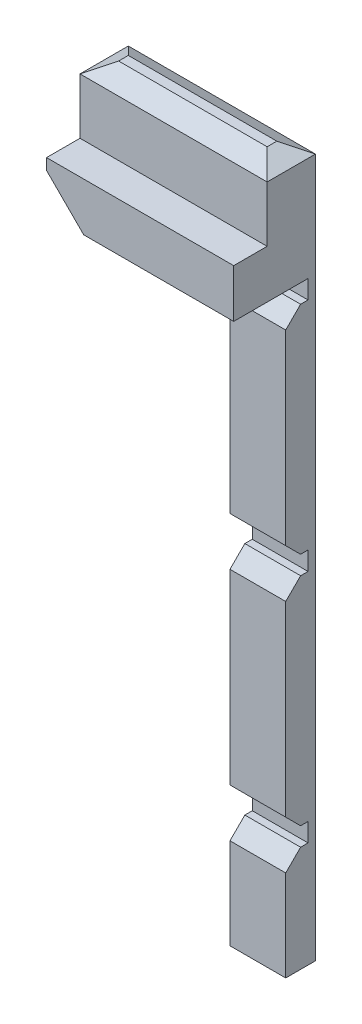
ISO-10303-21;
HEADER;
FILE_DESCRIPTION(('STEP AP214'),'2;1');
FILE_NAME('part.step','',(''),(''),'','','');
FILE_SCHEMA(('AUTOMOTIVE_DESIGN { 1 0 10303 214 1 1 1 1 }'));
ENDSEC;
DATA;
#1=APPLICATION_CONTEXT('core data for automotive mechanical design processes');
#2=APPLICATION_PROTOCOL_DEFINITION('international standard','automotive_design',2000,#1);
#3=PRODUCT_CONTEXT('',#1,'mechanical');
#4=PRODUCT('Part','Part','',(#3));
#5=PRODUCT_RELATED_PRODUCT_CATEGORY('part','',(#4));
#6=PRODUCT_DEFINITION_FORMATION('','',#4);
#7=PRODUCT_DEFINITION_CONTEXT('part definition',#1,'design');
#8=PRODUCT_DEFINITION('design','',#6,#7);
#9=PRODUCT_DEFINITION_SHAPE('','',#8);
#10=(LENGTH_UNIT() NAMED_UNIT(*) SI_UNIT(.MILLI.,.METRE.));
#11=(NAMED_UNIT(*) PLANE_ANGLE_UNIT() SI_UNIT($,.RADIAN.));
#12=(NAMED_UNIT(*) SI_UNIT($,.STERADIAN.) SOLID_ANGLE_UNIT());
#13=UNCERTAINTY_MEASURE_WITH_UNIT(LENGTH_MEASURE(1.E-05),#10,'distance_accuracy_value','');
#14=(GEOMETRIC_REPRESENTATION_CONTEXT(3) GLOBAL_UNCERTAINTY_ASSIGNED_CONTEXT((#13)) GLOBAL_UNIT_ASSIGNED_CONTEXT((#10,
#11,#12)) REPRESENTATION_CONTEXT('',''));
#15=CARTESIAN_POINT('',(0.,0.,0.));
#16=DIRECTION('',(0.,0.,1.));
#17=DIRECTION('',(1.,0.,0.));
#18=AXIS2_PLACEMENT_3D('',#15,#16,#17);
#19=CARTESIAN_POINT('',(-0.00360949708306024,-10.5868919372659,-4.06299852768101));
#20=DIRECTION('',(0.,0.,1.));
#21=DIRECTION('',(1.,0.,0.));
#22=AXIS2_PLACEMENT_3D('',#19,#20,#21);
#23=PLANE('',#22);
#24=DIRECTION('',(0.707106781186547,-0.707106781186548,0.));
#25=VECTOR('',#24,1.);
#26=CARTESIAN_POINT('',(-10.5091357632389,-17.8887340259845,-4.06299852768101));
#27=LINE('',#26,#25);
#28=CARTESIAN_POINT('',(-15.1109778519575,-13.2868919372659,-4.06299852768101));
#29=VERTEX_POINT('',#28);
#30=CARTESIAN_POINT('',(-9.11097785195748,-19.2868919372659,-4.06299852768101));
#31=VERTEX_POINT('',#30);
#32=EDGE_CURVE('E396',#29,#31,#27,.T.);
#33=ORIENTED_EDGE('',*,*,#32,.F.);
#34=DIRECTION('',(0.,-1.,0.));
#35=VECTOR('',#34,1.);
#36=CARTESIAN_POINT('',(-15.1109778519575,-6.53689193726586,-4.06299852768101));
#37=LINE('',#36,#35);
#38=CARTESIAN_POINT('',(-15.1109778519575,-2.48689193726586,-4.06299852768101));
#39=VERTEX_POINT('',#38);
#40=EDGE_CURVE('E316',#39,#29,#37,.T.);
#41=ORIENTED_EDGE('',*,*,#40,.F.);
#42=DIRECTION('',(-1.,0.,0.));
#43=VECTOR('',#42,1.);
#44=CARTESIAN_POINT('',(7.55007468035412,-2.48689193726586,-4.06299852768101));
#45=LINE('',#44,#43);
#46=CARTESIAN_POINT('',(15.1037588577913,-2.48689193726586,-4.06299852768101));
#47=VERTEX_POINT('',#46);
#48=EDGE_CURVE('E319',#47,#39,#45,.T.);
#49=ORIENTED_EDGE('',*,*,#48,.F.);
#50=DIRECTION('',(0.,1.,0.));
#51=VECTOR('',#50,1.);
#52=CARTESIAN_POINT('',(15.1037588577913,-14.9368919372659,-4.06299852768101));
#53=LINE('',#52,#51);
#54=CARTESIAN_POINT('',(15.1037588577913,-115.286891937266,-4.06299852768101));
#55=VERTEX_POINT('',#54);
#56=EDGE_CURVE('E357',#55,#47,#53,.T.);
#57=ORIENTED_EDGE('',*,*,#56,.F.);
#58=DIRECTION('',(1.,0.,0.));
#59=VECTOR('',#58,1.);
#60=CARTESIAN_POINT('',(3.10375885779133,-115.286891937266,-4.06299852768101));
#61=LINE('',#60,#59);
#62=CARTESIAN_POINT('',(6.10375885779132,-115.286891937266,-4.06299852768101));
#63=VERTEX_POINT('',#62);
#64=EDGE_CURVE('E436',#63,#55,#61,.T.);
#65=ORIENTED_EDGE('',*,*,#64,.F.);
#66=DIRECTION('',(0.,-1.,0.));
#67=VECTOR('',#66,1.);
#68=CARTESIAN_POINT('',(6.10375885779132,-14.9368919372659,-4.06299852768101));
#69=LINE('',#68,#67);
#70=CARTESIAN_POINT('',(6.10375885779132,-19.2868919372659,-4.06299852768101));
#71=VERTEX_POINT('',#70);
#72=EDGE_CURVE('E24',#71,#63,#69,.T.);
#73=ORIENTED_EDGE('',*,*,#72,.F.);
#74=DIRECTION('',(1.,0.,0.));
#75=VECTOR('',#74,1.);
#76=CARTESIAN_POINT('',(-7.55729367452028,-19.2868919372659,-4.06299852768101));
#77=LINE('',#76,#75);
#78=EDGE_CURVE('E10',#31,#71,#77,.T.);
#79=ORIENTED_EDGE('',*,*,#78,.F.);
#80=EDGE_LOOP('',(#33,#41,#49,#57,#65,#73,#79));
#81=FACE_BOUND('',#80,.T.);
#82=ADVANCED_FACE('F16',(#81),#23,.F.);
#83=CARTESIAN_POINT('',(-15.1109778519575,-19.2868919372659,-4.66299852768101));
#84=DIRECTION('',(0.,-1.,0.));
#85=DIRECTION('',(0.,0.,-1.));
#86=AXIS2_PLACEMENT_3D('',#83,#84,#85);
#87=PLANE('',#86);
#88=DIRECTION('',(0.,0.,1.));
#89=VECTOR('',#88,1.);
#90=CARTESIAN_POINT('',(-9.11097785195748,-19.2868919372659,3.73700147231899));
#91=LINE('',#90,#89);
#92=CARTESIAN_POINT('',(-9.11097785195748,-19.2868919372659,9.13700147231898));
#93=VERTEX_POINT('',#92);
#94=EDGE_CURVE('E399',#31,#93,#91,.T.);
#95=ORIENTED_EDGE('',*,*,#94,.F.);
#96=ORIENTED_EDGE('',*,*,#78,.T.);
#97=DIRECTION('',(0.,0.,1.));
#98=VECTOR('',#97,1.);
#99=CARTESIAN_POINT('',(6.10375885779132,-19.2868919372659,-4.36299852768102));
#100=LINE('',#99,#98);
#101=CARTESIAN_POINT('',(6.10375885779132,-19.2868919372659,-2.86299852768101));
#102=VERTEX_POINT('',#101);
#103=EDGE_CURVE('E307',#71,#102,#100,.T.);
#104=ORIENTED_EDGE('',*,*,#103,.T.);
#105=DIRECTION('',(1.,0.,0.));
#106=VECTOR('',#105,1.);
#107=CARTESIAN_POINT('',(-7.55729367452028,-19.2868919372659,-2.86299852768101));
#108=LINE('',#107,#106);
#109=CARTESIAN_POINT('',(15.1037588577913,-19.2868919372659,-2.86299852768101));
#110=VERTEX_POINT('',#109);
#111=EDGE_CURVE('E440',#102,#110,#108,.T.);
#112=ORIENTED_EDGE('',*,*,#111,.T.);
#113=DIRECTION('',(0.,0.,1.));
#114=VECTOR('',#113,1.);
#115=CARTESIAN_POINT('',(15.1037588577913,-19.2868919372659,3.73700147231899));
#116=LINE('',#115,#114);
#117=CARTESIAN_POINT('',(15.1037588577913,-19.2868919372659,9.13700147231898));
#118=VERTEX_POINT('',#117);
#119=EDGE_CURVE('E354',#110,#118,#116,.T.);
#120=ORIENTED_EDGE('',*,*,#119,.T.);
#121=DIRECTION('',(1.,0.,0.));
#122=VECTOR('',#121,1.);
#123=CARTESIAN_POINT('',(-9.11097785195748,-19.2868919372659,9.13700147231898));
#124=LINE('',#123,#122);
#125=EDGE_CURVE('E351',#93,#118,#124,.T.);
#126=ORIENTED_EDGE('',*,*,#125,.F.);
#127=EDGE_LOOP('',(#95,#96,#104,#112,#120,#126));
#128=FACE_BOUND('',#127,.T.);
#129=ADVANCED_FACE('F848',(#128),#87,.T.);
#130=CARTESIAN_POINT('',(6.10375885779132,-19.2868919372659,-4.06299852768101));
#131=DIRECTION('',(-1.,0.,0.));
#132=DIRECTION('',(0.,0.,1.));
#133=AXIS2_PLACEMENT_3D('',#130,#131,#132);
#134=PLANE('',#133);
#135=DIRECTION('',(0.,-0.707106781186548,0.707106781186547));
#136=VECTOR('',#135,1.);
#137=CARTESIAN_POINT('',(6.10375885779132,-78.473023736247,-21.3917091273414));
#138=LINE('',#137,#136);
#139=CARTESIAN_POINT('',(6.10375885779132,-98.2017343359072,-1.66299852768101));
#140=VERTEX_POINT('',#139);
#141=CARTESIAN_POINT('',(6.10375885779132,-100.601734335907,0.737001472318992));
#142=VERTEX_POINT('',#141);
#143=EDGE_CURVE('E313',#140,#142,#138,.T.);
#144=ORIENTED_EDGE('',*,*,#143,.F.);
#145=DIRECTION('',(0.,0.,1.));
#146=VECTOR('',#145,1.);
#147=CARTESIAN_POINT('',(6.10375885779132,-98.2017343359072,-2.86299852768101));
#148=LINE('',#147,#146);
#149=CARTESIAN_POINT('',(6.10375885779132,-98.2017343359072,-2.86299852768101));
#150=VERTEX_POINT('',#149);
#151=EDGE_CURVE('E385',#150,#140,#148,.T.);
#152=ORIENTED_EDGE('',*,*,#151,.F.);
#153=DIRECTION('',(0.,-1.,0.));
#154=VECTOR('',#153,1.);
#155=CARTESIAN_POINT('',(6.10375885779132,-39.0868919372658,-2.86299852768101));
#156=LINE('',#155,#154);
#157=CARTESIAN_POINT('',(6.10375885779132,-95.2017343359072,-2.86299852768101));
#158=VERTEX_POINT('',#157);
#159=EDGE_CURVE('E421',#158,#150,#156,.T.);
#160=ORIENTED_EDGE('',*,*,#159,.F.);
#161=DIRECTION('',(0.,0.,1.));
#162=VECTOR('',#161,1.);
#163=CARTESIAN_POINT('',(6.10375885779132,-95.2017343359072,-2.86299852768101));
#164=LINE('',#163,#162);
#165=CARTESIAN_POINT('',(6.10375885779132,-95.2017343359072,-1.66299852768101));
#166=VERTEX_POINT('',#165);
#167=EDGE_CURVE('E535',#158,#166,#164,.T.);
#168=ORIENTED_EDGE('',*,*,#167,.T.);
#169=DIRECTION('',(0.,-0.707106781186548,-0.707106781186547));
#170=VECTOR('',#169,1.);
#171=CARTESIAN_POINT('',(6.10375885779132,-76.223023736247,17.3157120719793));
#172=LINE('',#171,#170);
#173=CARTESIAN_POINT('',(6.10375885779132,-92.8017343359072,0.737001472318992));
#174=VERTEX_POINT('',#173);
#175=EDGE_CURVE('E499',#174,#166,#172,.T.);
#176=ORIENTED_EDGE('',*,*,#175,.F.);
#177=DIRECTION('',(0.,-1.,0.));
#178=VECTOR('',#177,1.);
#179=CARTESIAN_POINT('',(6.10375885779132,-95.2017343359072,0.737001472318992));
#180=LINE('',#179,#178);
#181=CARTESIAN_POINT('',(6.10375885779132,-62.6443131365868,0.737001472318992));
#182=VERTEX_POINT('',#181);
#183=EDGE_CURVE('E461',#182,#174,#180,.T.);
#184=ORIENTED_EDGE('',*,*,#183,.F.);
#185=DIRECTION('',(0.,-0.707106781186548,0.707106781186547));
#186=VECTOR('',#185,1.);
#187=CARTESIAN_POINT('',(6.10375885779132,-50.0049578367564,-11.9023538275112));
#188=LINE('',#187,#186);
#189=CARTESIAN_POINT('',(6.10375885779132,-60.2443131365868,-1.66299852768101));
#190=VERTEX_POINT('',#189);
#191=EDGE_CURVE('E415',#190,#182,#188,.T.);
#192=ORIENTED_EDGE('',*,*,#191,.F.);
#193=DIRECTION('',(0.,0.,1.));
#194=VECTOR('',#193,1.);
#195=CARTESIAN_POINT('',(6.10375885779132,-60.2443131365868,-2.86299852768101));
#196=LINE('',#195,#194);
#197=CARTESIAN_POINT('',(6.10375885779132,-60.2443131365868,-2.86299852768101));
#198=VERTEX_POINT('',#197);
#199=EDGE_CURVE('E333',#198,#190,#196,.T.);
#200=ORIENTED_EDGE('',*,*,#199,.F.);
#201=DIRECTION('',(0.,-1.,0.));
#202=VECTOR('',#201,1.);
#203=CARTESIAN_POINT('',(6.10375885779132,-39.0868919372658,-2.86299852768101));
#204=LINE('',#203,#202);
#205=CARTESIAN_POINT('',(6.10375885779132,-57.2443131365866,-2.86299852768101));
#206=VERTEX_POINT('',#205);
#207=EDGE_CURVE('E426',#206,#198,#204,.T.);
#208=ORIENTED_EDGE('',*,*,#207,.F.);
#209=DIRECTION('',(0.,0.,1.));
#210=VECTOR('',#209,1.);
#211=CARTESIAN_POINT('',(6.10375885779132,-57.2443131365866,-2.86299852768101));
#212=LINE('',#211,#210);
#213=CARTESIAN_POINT('',(6.10375885779132,-57.2443131365866,-1.66299852768101));
#214=VERTEX_POINT('',#213);
#215=EDGE_CURVE('E388',#206,#214,#212,.T.);
#216=ORIENTED_EDGE('',*,*,#215,.T.);
#217=DIRECTION('',(0.,-0.707106781186548,-0.707106781186547));
#218=VECTOR('',#217,1.);
#219=CARTESIAN_POINT('',(6.10375885779132,-47.7549578367564,7.8263567721492));
#220=LINE('',#219,#218);
#221=CARTESIAN_POINT('',(6.10375885779132,-54.8443131365866,0.737001472318992));
#222=VERTEX_POINT('',#221);
#223=EDGE_CURVE('E331',#222,#214,#220,.T.);
#224=ORIENTED_EDGE('',*,*,#223,.F.);
#225=DIRECTION('',(0.,-1.,0.));
#226=VECTOR('',#225,1.);
#227=CARTESIAN_POINT('',(6.10375885779132,-57.2443131365866,0.737001472318992));
#228=LINE('',#227,#226);
#229=CARTESIAN_POINT('',(6.10375885779132,-24.6868919372659,0.737001472318992));
#230=VERTEX_POINT('',#229);
#231=EDGE_CURVE('E346',#230,#222,#228,.T.);
#232=ORIENTED_EDGE('',*,*,#231,.F.);
#233=DIRECTION('',(0.,-0.707106781186547,0.707106781186548));
#234=VECTOR('',#233,1.);
#235=CARTESIAN_POINT('',(6.10375885779132,-21.5368919372658,-2.41299852768102));
#236=LINE('',#235,#234);
#237=CARTESIAN_POINT('',(6.10375885779132,-22.2868919372658,-1.66299852768101));
#238=VERTEX_POINT('',#237);
#239=EDGE_CURVE('E517',#238,#230,#236,.T.);
#240=ORIENTED_EDGE('',*,*,#239,.F.);
#241=DIRECTION('',(0.,0.,1.));
#242=VECTOR('',#241,1.);
#243=CARTESIAN_POINT('',(6.10375885779132,-22.2868919372658,-2.86299852768101));
#244=LINE('',#243,#242);
#245=CARTESIAN_POINT('',(6.10375885779132,-22.2868919372658,-2.86299852768101));
#246=VERTEX_POINT('',#245);
#247=EDGE_CURVE('E530',#246,#238,#244,.T.);
#248=ORIENTED_EDGE('',*,*,#247,.F.);
#249=DIRECTION('',(0.,-1.,0.));
#250=VECTOR('',#249,1.);
#251=CARTESIAN_POINT('',(6.10375885779132,-39.0868919372658,-2.86299852768101));
#252=LINE('',#251,#250);
#253=EDGE_CURVE('E433',#102,#246,#252,.T.);
#254=ORIENTED_EDGE('',*,*,#253,.F.);
#255=ORIENTED_EDGE('',*,*,#103,.F.);
#256=ORIENTED_EDGE('',*,*,#72,.T.);
#257=DIRECTION('',(0.,0.,1.));
#258=VECTOR('',#257,1.);
#259=CARTESIAN_POINT('',(6.10375885779132,-115.286891937266,-4.06299852768101));
#260=LINE('',#259,#258);
#261=CARTESIAN_POINT('',(6.10375885779132,-115.286891937266,0.737001472318992));
#262=VERTEX_POINT('',#261);
#263=EDGE_CURVE('E309',#63,#262,#260,.T.);
#264=ORIENTED_EDGE('',*,*,#263,.T.);
#265=DIRECTION('',(0.,-1.,0.));
#266=VECTOR('',#265,1.);
#267=CARTESIAN_POINT('',(6.10375885779132,-115.286891937266,0.737001472318992));
#268=LINE('',#267,#266);
#269=EDGE_CURVE('E509',#142,#262,#268,.T.);
#270=ORIENTED_EDGE('',*,*,#269,.F.);
#271=EDGE_LOOP('',(#144,#152,#160,#168,#176,#184,#192,#200,#208,#216,#224,#232,#240,#248,#254,
#255,#256,#264,#270));
#272=FACE_BOUND('',#271,.T.);
#273=ADVANCED_FACE('F853',(#272),#134,.T.);
#274=CARTESIAN_POINT('',(3.10375885779133,-115.286891937266,-4.06299852768101));
#275=DIRECTION('',(0.,-1.,0.));
#276=DIRECTION('',(0.,0.,-1.));
#277=AXIS2_PLACEMENT_3D('',#274,#275,#276);
#278=PLANE('',#277);
#279=ORIENTED_EDGE('',*,*,#64,.T.);
#280=DIRECTION('',(0.,0.,1.));
#281=VECTOR('',#280,1.);
#282=CARTESIAN_POINT('',(15.1037588577913,-115.286891937266,-4.06299852768101));
#283=LINE('',#282,#281);
#284=CARTESIAN_POINT('',(15.1037588577913,-115.286891937266,0.737001472318992));
#285=VERTEX_POINT('',#284);
#286=EDGE_CURVE('E381',#55,#285,#283,.T.);
#287=ORIENTED_EDGE('',*,*,#286,.T.);
#288=DIRECTION('',(1.,0.,0.));
#289=VECTOR('',#288,1.);
#290=CARTESIAN_POINT('',(15.1037588577913,-115.286891937266,0.737001472318992));
#291=LINE('',#290,#289);
#292=EDGE_CURVE('E430',#262,#285,#291,.T.);
#293=ORIENTED_EDGE('',*,*,#292,.F.);
#294=ORIENTED_EDGE('',*,*,#263,.F.);
#295=EDGE_LOOP('',(#279,#287,#293,#294));
#296=FACE_BOUND('',#295,.T.);
#297=ADVANCED_FACE('F857',(#296),#278,.T.);
#298=CARTESIAN_POINT('',(-0.00360949708306024,-58.8868919372659,-2.86299852768101));
#299=DIRECTION('',(0.,0.,1.));
#300=DIRECTION('',(1.,0.,0.));
#301=AXIS2_PLACEMENT_3D('',#298,#299,#300);
#302=PLANE('',#301);
#303=DIRECTION('',(1.,0.,0.));
#304=VECTOR('',#303,1.);
#305=CARTESIAN_POINT('',(7.55007468035412,-22.2868919372658,-2.86299852768101));
#306=LINE('',#305,#304);
#307=CARTESIAN_POINT('',(15.1037588577913,-22.2868919372658,-2.86299852768101));
#308=VERTEX_POINT('',#307);
#309=EDGE_CURVE('E386',#246,#308,#306,.T.);
#310=ORIENTED_EDGE('',*,*,#309,.T.);
#311=DIRECTION('',(0.,1.,0.));
#312=VECTOR('',#311,1.);
#313=CARTESIAN_POINT('',(15.1037588577913,-115.286891937266,-2.86299852768101));
#314=LINE('',#313,#312);
#315=EDGE_CURVE('E358',#308,#110,#314,.T.);
#316=ORIENTED_EDGE('',*,*,#315,.T.);
#317=ORIENTED_EDGE('',*,*,#111,.F.);
#318=ORIENTED_EDGE('',*,*,#253,.T.);
#319=EDGE_LOOP('',(#310,#316,#317,#318));
#320=FACE_BOUND('',#319,.T.);
#321=ADVANCED_FACE('F865',(#320),#302,.T.);
#322=CARTESIAN_POINT('',(-0.00360949708306024,-58.8868919372659,-2.86299852768101));
#323=DIRECTION('',(0.,0.,1.));
#324=DIRECTION('',(1.,0.,0.));
#325=AXIS2_PLACEMENT_3D('',#322,#323,#324);
#326=PLANE('',#325);
#327=DIRECTION('',(-1.,0.,0.));
#328=VECTOR('',#327,1.);
#329=CARTESIAN_POINT('',(3.05007468035414,-57.2443131365866,-2.86299852768101));
#330=LINE('',#329,#328);
#331=CARTESIAN_POINT('',(15.1037588577913,-57.2443131365866,-2.86299852768101));
#332=VERTEX_POINT('',#331);
#333=EDGE_CURVE('E387',#332,#206,#330,.T.);
#334=ORIENTED_EDGE('',*,*,#333,.T.);
#335=ORIENTED_EDGE('',*,*,#207,.T.);
#336=DIRECTION('',(1.,0.,0.));
#337=VECTOR('',#336,1.);
#338=CARTESIAN_POINT('',(7.55007468035412,-60.2443131365868,-2.86299852768101));
#339=LINE('',#338,#337);
#340=CARTESIAN_POINT('',(15.1037588577913,-60.2443131365868,-2.86299852768101));
#341=VERTEX_POINT('',#340);
#342=EDGE_CURVE('E411',#198,#341,#339,.T.);
#343=ORIENTED_EDGE('',*,*,#342,.T.);
#344=DIRECTION('',(0.,1.,0.));
#345=VECTOR('',#344,1.);
#346=CARTESIAN_POINT('',(15.1037588577913,-115.286891937266,-2.86299852768101));
#347=LINE('',#346,#345);
#348=EDGE_CURVE('E362',#341,#332,#347,.T.);
#349=ORIENTED_EDGE('',*,*,#348,.T.);
#350=EDGE_LOOP('',(#334,#335,#343,#349));
#351=FACE_BOUND('',#350,.T.);
#352=ADVANCED_FACE('F866',(#351),#326,.T.);
#353=CARTESIAN_POINT('',(-0.00360949708306024,-58.8868919372659,-2.86299852768101));
#354=DIRECTION('',(0.,0.,1.));
#355=DIRECTION('',(1.,0.,0.));
#356=AXIS2_PLACEMENT_3D('',#353,#354,#355);
#357=PLANE('',#356);
#358=DIRECTION('',(-1.,0.,0.));
#359=VECTOR('',#358,1.);
#360=CARTESIAN_POINT('',(3.05007468035414,-95.2017343359072,-2.86299852768101));
#361=LINE('',#360,#359);
#362=CARTESIAN_POINT('',(15.1037588577913,-95.2017343359072,-2.86299852768101));
#363=VERTEX_POINT('',#362);
#364=EDGE_CURVE('E512',#363,#158,#361,.T.);
#365=ORIENTED_EDGE('',*,*,#364,.T.);
#366=ORIENTED_EDGE('',*,*,#159,.T.);
#367=DIRECTION('',(1.,0.,0.));
#368=VECTOR('',#367,1.);
#369=CARTESIAN_POINT('',(7.55007468035412,-98.2017343359072,-2.86299852768101));
#370=LINE('',#369,#368);
#371=CARTESIAN_POINT('',(15.1037588577913,-98.2017343359072,-2.86299852768101));
#372=VERTEX_POINT('',#371);
#373=EDGE_CURVE('E338',#150,#372,#370,.T.);
#374=ORIENTED_EDGE('',*,*,#373,.T.);
#375=DIRECTION('',(0.,1.,0.));
#376=VECTOR('',#375,1.);
#377=CARTESIAN_POINT('',(15.1037588577913,-115.286891937266,-2.86299852768101));
#378=LINE('',#377,#376);
#379=EDGE_CURVE('E489',#372,#363,#378,.T.);
#380=ORIENTED_EDGE('',*,*,#379,.T.);
#381=EDGE_LOOP('',(#365,#366,#374,#380));
#382=FACE_BOUND('',#381,.T.);
#383=ADVANCED_FACE('F869',(#382),#357,.T.);
#384=CARTESIAN_POINT('',(10.6037588577913,-68.7868919372658,0.737001472318992));
#385=DIRECTION('',(0.,0.,1.));
#386=DIRECTION('',(1.,0.,0.));
#387=AXIS2_PLACEMENT_3D('',#384,#385,#386);
#388=PLANE('',#387);
#389=DIRECTION('',(1.,0.,0.));
#390=VECTOR('',#389,1.);
#391=CARTESIAN_POINT('',(12.8537588577913,-100.601734335907,0.737001472318992));
#392=LINE('',#391,#390);
#393=CARTESIAN_POINT('',(15.1037588577913,-100.601734335907,0.737001472318992));
#394=VERTEX_POINT('',#393);
#395=EDGE_CURVE('E312',#142,#394,#392,.T.);
#396=ORIENTED_EDGE('',*,*,#395,.F.);
#397=ORIENTED_EDGE('',*,*,#269,.T.);
#398=ORIENTED_EDGE('',*,*,#292,.T.);
#399=DIRECTION('',(0.,1.,0.));
#400=VECTOR('',#399,1.);
#401=CARTESIAN_POINT('',(15.1037588577913,-98.2017343359072,0.737001472318992));
#402=LINE('',#401,#400);
#403=EDGE_CURVE('E378',#285,#394,#402,.T.);
#404=ORIENTED_EDGE('',*,*,#403,.T.);
#405=EDGE_LOOP('',(#396,#397,#398,#404));
#406=FACE_BOUND('',#405,.T.);
#407=ADVANCED_FACE('F872',(#406),#388,.T.);
#408=CARTESIAN_POINT('',(6.10375885779132,-95.2017343359072,-2.86299852768101));
#409=DIRECTION('',(0.,-1.,0.));
#410=DIRECTION('',(0.,0.,-1.));
#411=AXIS2_PLACEMENT_3D('',#408,#409,#410);
#412=PLANE('',#411);
#413=DIRECTION('',(1.,0.,0.));
#414=VECTOR('',#413,1.);
#415=CARTESIAN_POINT('',(8.35375885779132,-95.2017343359072,-1.66299852768101));
#416=LINE('',#415,#414);
#417=CARTESIAN_POINT('',(15.1037588577913,-95.2017343359072,-1.66299852768101));
#418=VERTEX_POINT('',#417);
#419=EDGE_CURVE('E465',#166,#418,#416,.T.);
#420=ORIENTED_EDGE('',*,*,#419,.F.);
#421=ORIENTED_EDGE('',*,*,#167,.F.);
#422=ORIENTED_EDGE('',*,*,#364,.F.);
#423=DIRECTION('',(0.,0.,1.));
#424=VECTOR('',#423,1.);
#425=CARTESIAN_POINT('',(15.1037588577913,-95.2017343359072,-2.86299852768101));
#426=LINE('',#425,#424);
#427=EDGE_CURVE('E486',#363,#418,#426,.T.);
#428=ORIENTED_EDGE('',*,*,#427,.T.);
#429=EDGE_LOOP('',(#420,#421,#422,#428));
#430=FACE_BOUND('',#429,.T.);
#431=ADVANCED_FACE('F877',(#430),#412,.T.);
#432=CARTESIAN_POINT('',(15.1037588577913,-22.2868919372658,-2.86299852768101));
#433=DIRECTION('',(0.,1.,0.));
#434=DIRECTION('',(1.,0.,0.));
#435=AXIS2_PLACEMENT_3D('',#432,#433,#434);
#436=PLANE('',#435);
#437=DIRECTION('',(-1.,0.,0.));
#438=VECTOR('',#437,1.);
#439=CARTESIAN_POINT('',(12.8537588577913,-22.2868919372658,-1.66299852768101));
#440=LINE('',#439,#438);
#441=CARTESIAN_POINT('',(15.1037588577913,-22.2868919372658,-1.66299852768101));
#442=VERTEX_POINT('',#441);
#443=EDGE_CURVE('E299',#442,#238,#440,.T.);
#444=ORIENTED_EDGE('',*,*,#443,.F.);
#445=DIRECTION('',(0.,0.,1.));
#446=VECTOR('',#445,1.);
#447=CARTESIAN_POINT('',(15.1037588577913,-22.2868919372658,-2.86299852768101));
#448=LINE('',#447,#446);
#449=EDGE_CURVE('E443',#308,#442,#448,.T.);
#450=ORIENTED_EDGE('',*,*,#449,.F.);
#451=ORIENTED_EDGE('',*,*,#309,.F.);
#452=ORIENTED_EDGE('',*,*,#247,.T.);
#453=EDGE_LOOP('',(#444,#450,#451,#452));
#454=FACE_BOUND('',#453,.T.);
#455=ADVANCED_FACE('F885',(#454),#436,.T.);
#456=CARTESIAN_POINT('',(6.10375885779132,-57.2443131365866,-2.86299852768101));
#457=DIRECTION('',(0.,-1.,0.));
#458=DIRECTION('',(0.,0.,-1.));
#459=AXIS2_PLACEMENT_3D('',#456,#457,#458);
#460=PLANE('',#459);
#461=DIRECTION('',(1.,0.,0.));
#462=VECTOR('',#461,1.);
#463=CARTESIAN_POINT('',(8.35375885779132,-57.2443131365866,-1.66299852768101));
#464=LINE('',#463,#462);
#465=CARTESIAN_POINT('',(15.1037588577913,-57.2443131365866,-1.66299852768101));
#466=VERTEX_POINT('',#465);
#467=EDGE_CURVE('E348',#214,#466,#464,.T.);
#468=ORIENTED_EDGE('',*,*,#467,.F.);
#469=ORIENTED_EDGE('',*,*,#215,.F.);
#470=ORIENTED_EDGE('',*,*,#333,.F.);
#471=DIRECTION('',(0.,0.,1.));
#472=VECTOR('',#471,1.);
#473=CARTESIAN_POINT('',(15.1037588577913,-57.2443131365866,-2.86299852768101));
#474=LINE('',#473,#472);
#475=EDGE_CURVE('E370',#332,#466,#474,.T.);
#476=ORIENTED_EDGE('',*,*,#475,.T.);
#477=EDGE_LOOP('',(#468,#469,#470,#476));
#478=FACE_BOUND('',#477,.T.);
#479=ADVANCED_FACE('F886',(#478),#460,.T.);
#480=CARTESIAN_POINT('',(12.8537588577913,-23.4868919372659,-0.46299852768101));
#481=DIRECTION('',(0.,0.707106781186548,0.707106781186547));
#482=DIRECTION('',(1.,0.,0.));
#483=AXIS2_PLACEMENT_3D('',#480,#481,#482);
#484=PLANE('',#483);
#485=ORIENTED_EDGE('',*,*,#239,.T.);
#486=DIRECTION('',(1.,0.,0.));
#487=VECTOR('',#486,1.);
#488=CARTESIAN_POINT('',(12.8537588577913,-24.6868919372659,0.737001472318992));
#489=LINE('',#488,#487);
#490=CARTESIAN_POINT('',(15.1037588577913,-24.6868919372659,0.737001472318992));
#491=VERTEX_POINT('',#490);
#492=EDGE_CURVE('E342',#230,#491,#489,.T.);
#493=ORIENTED_EDGE('',*,*,#492,.T.);
#494=DIRECTION('',(0.,0.707106781186547,-0.707106781186548));
#495=VECTOR('',#494,1.);
#496=CARTESIAN_POINT('',(15.1037588577913,-21.3868919372659,-2.56299852768101));
#497=LINE('',#496,#495);
#498=EDGE_CURVE('E448',#491,#442,#497,.T.);
#499=ORIENTED_EDGE('',*,*,#498,.T.);
#500=ORIENTED_EDGE('',*,*,#443,.T.);
#501=EDGE_LOOP('',(#485,#493,#499,#500));
#502=FACE_BOUND('',#501,.T.);
#503=ADVANCED_FACE('F890',(#502),#484,.T.);
#504=CARTESIAN_POINT('',(10.6037588577913,-68.7868919372658,0.737001472318992));
#505=DIRECTION('',(0.,0.,1.));
#506=DIRECTION('',(1.,0.,0.));
#507=AXIS2_PLACEMENT_3D('',#504,#505,#506);
#508=PLANE('',#507);
#509=DIRECTION('',(-1.,0.,0.));
#510=VECTOR('',#509,1.);
#511=CARTESIAN_POINT('',(8.35375885779132,-54.8443131365866,0.737001472318992));
#512=LINE('',#511,#510);
#513=CARTESIAN_POINT('',(15.1037588577913,-54.8443131365866,0.737001472318992));
#514=VERTEX_POINT('',#513);
#515=EDGE_CURVE('E329',#514,#222,#512,.T.);
#516=ORIENTED_EDGE('',*,*,#515,.F.);
#517=DIRECTION('',(0.,1.,0.));
#518=VECTOR('',#517,1.);
#519=CARTESIAN_POINT('',(15.1037588577913,-22.2868919372658,0.737001472318992));
#520=LINE('',#519,#518);
#521=EDGE_CURVE('E453',#514,#491,#520,.T.);
#522=ORIENTED_EDGE('',*,*,#521,.T.);
#523=ORIENTED_EDGE('',*,*,#492,.F.);
#524=ORIENTED_EDGE('',*,*,#231,.T.);
#525=EDGE_LOOP('',(#516,#522,#523,#524));
#526=FACE_BOUND('',#525,.T.);
#527=ADVANCED_FACE('F892',(#526),#508,.T.);
#528=CARTESIAN_POINT('',(8.35375885779132,-56.0443131365866,-0.46299852768101));
#529=DIRECTION('',(0.,-0.707106781186547,0.707106781186548));
#530=DIRECTION('',(-1.,0.,0.));
#531=AXIS2_PLACEMENT_3D('',#528,#529,#530);
#532=PLANE('',#531);
#533=DIRECTION('',(0.,0.707106781186548,0.707106781186547));
#534=VECTOR('',#533,1.);
#535=CARTESIAN_POINT('',(15.1037588577913,-47.9049578367564,7.6763567721492));
#536=LINE('',#535,#534);
#537=EDGE_CURVE('E456',#466,#514,#536,.T.);
#538=ORIENTED_EDGE('',*,*,#537,.T.);
#539=ORIENTED_EDGE('',*,*,#515,.T.);
#540=ORIENTED_EDGE('',*,*,#223,.T.);
#541=ORIENTED_EDGE('',*,*,#467,.T.);
#542=EDGE_LOOP('',(#538,#539,#540,#541));
#543=FACE_BOUND('',#542,.T.);
#544=ADVANCED_FACE('F898',(#543),#532,.T.);
#545=CARTESIAN_POINT('',(15.1037588577913,-60.2443131365868,-2.86299852768101));
#546=DIRECTION('',(0.,1.,0.));
#547=DIRECTION('',(1.,0.,0.));
#548=AXIS2_PLACEMENT_3D('',#545,#546,#547);
#549=PLANE('',#548);
#550=DIRECTION('',(-1.,0.,0.));
#551=VECTOR('',#550,1.);
#552=CARTESIAN_POINT('',(12.8537588577913,-60.2443131365868,-1.66299852768101));
#553=LINE('',#552,#551);
#554=CARTESIAN_POINT('',(15.1037588577913,-60.2443131365868,-1.66299852768101));
#555=VERTEX_POINT('',#554);
#556=EDGE_CURVE('E410',#555,#190,#553,.T.);
#557=ORIENTED_EDGE('',*,*,#556,.F.);
#558=DIRECTION('',(0.,0.,1.));
#559=VECTOR('',#558,1.);
#560=CARTESIAN_POINT('',(15.1037588577913,-60.2443131365868,-2.86299852768101));
#561=LINE('',#560,#559);
#562=EDGE_CURVE('E368',#341,#555,#561,.T.);
#563=ORIENTED_EDGE('',*,*,#562,.F.);
#564=ORIENTED_EDGE('',*,*,#342,.F.);
#565=ORIENTED_EDGE('',*,*,#199,.T.);
#566=EDGE_LOOP('',(#557,#563,#564,#565));
#567=FACE_BOUND('',#566,.T.);
#568=ADVANCED_FACE('F905',(#567),#549,.T.);
#569=CARTESIAN_POINT('',(12.8537588577913,-61.4443131365868,-0.46299852768101));
#570=DIRECTION('',(0.,0.707106781186547,0.707106781186548));
#571=DIRECTION('',(1.,0.,0.));
#572=AXIS2_PLACEMENT_3D('',#569,#570,#571);
#573=PLANE('',#572);
#574=ORIENTED_EDGE('',*,*,#191,.T.);
#575=DIRECTION('',(1.,0.,0.));
#576=VECTOR('',#575,1.);
#577=CARTESIAN_POINT('',(12.8537588577913,-62.6443131365868,0.737001472318992));
#578=LINE('',#577,#576);
#579=CARTESIAN_POINT('',(15.1037588577913,-62.6443131365868,0.737001472318992));
#580=VERTEX_POINT('',#579);
#581=EDGE_CURVE('E458',#182,#580,#578,.T.);
#582=ORIENTED_EDGE('',*,*,#581,.T.);
#583=DIRECTION('',(0.,0.707106781186548,-0.707106781186547));
#584=VECTOR('',#583,1.);
#585=CARTESIAN_POINT('',(15.1037588577913,-49.8549578367564,-12.0523538275112));
#586=LINE('',#585,#584);
#587=EDGE_CURVE('E475',#580,#555,#586,.T.);
#588=ORIENTED_EDGE('',*,*,#587,.T.);
#589=ORIENTED_EDGE('',*,*,#556,.T.);
#590=EDGE_LOOP('',(#574,#582,#588,#589));
#591=FACE_BOUND('',#590,.T.);
#592=ADVANCED_FACE('F906',(#591),#573,.T.);
#593=CARTESIAN_POINT('',(10.6037588577913,-68.7868919372658,0.737001472318992));
#594=DIRECTION('',(0.,0.,1.));
#595=DIRECTION('',(1.,0.,0.));
#596=AXIS2_PLACEMENT_3D('',#593,#594,#595);
#597=PLANE('',#596);
#598=DIRECTION('',(-1.,0.,0.));
#599=VECTOR('',#598,1.);
#600=CARTESIAN_POINT('',(8.35375885779132,-92.8017343359072,0.737001472318992));
#601=LINE('',#600,#599);
#602=CARTESIAN_POINT('',(15.1037588577913,-92.8017343359072,0.737001472318992));
#603=VERTEX_POINT('',#602);
#604=EDGE_CURVE('E493',#603,#174,#601,.T.);
#605=ORIENTED_EDGE('',*,*,#604,.F.);
#606=DIRECTION('',(0.,1.,0.));
#607=VECTOR('',#606,1.);
#608=CARTESIAN_POINT('',(15.1037588577913,-60.2443131365868,0.737001472318992));
#609=LINE('',#608,#607);
#610=EDGE_CURVE('E476',#603,#580,#609,.T.);
#611=ORIENTED_EDGE('',*,*,#610,.T.);
#612=ORIENTED_EDGE('',*,*,#581,.F.);
#613=ORIENTED_EDGE('',*,*,#183,.T.);
#614=EDGE_LOOP('',(#605,#611,#612,#613));
#615=FACE_BOUND('',#614,.T.);
#616=ADVANCED_FACE('F909',(#615),#597,.T.);
#617=CARTESIAN_POINT('',(8.35375885779132,-94.0017343359072,-0.46299852768101));
#618=DIRECTION('',(0.,-0.707106781186547,0.707106781186548));
#619=DIRECTION('',(-1.,0.,0.));
#620=AXIS2_PLACEMENT_3D('',#617,#618,#619);
#621=PLANE('',#620);
#622=DIRECTION('',(0.,0.707106781186548,0.707106781186547));
#623=VECTOR('',#622,1.);
#624=CARTESIAN_POINT('',(15.1037588577913,-76.373023736247,17.1657120719793));
#625=LINE('',#624,#623);
#626=EDGE_CURVE('E485',#418,#603,#625,.T.);
#627=ORIENTED_EDGE('',*,*,#626,.T.);
#628=ORIENTED_EDGE('',*,*,#604,.T.);
#629=ORIENTED_EDGE('',*,*,#175,.T.);
#630=ORIENTED_EDGE('',*,*,#419,.T.);
#631=EDGE_LOOP('',(#627,#628,#629,#630));
#632=FACE_BOUND('',#631,.T.);
#633=ADVANCED_FACE('F915',(#632),#621,.T.);
#634=CARTESIAN_POINT('',(15.1037588577913,-19.2868919372659,-4.66299852768101));
#635=DIRECTION('',(1.,0.,0.));
#636=DIRECTION('',(0.,1.,0.));
#637=AXIS2_PLACEMENT_3D('',#634,#635,#636);
#638=PLANE('',#637);
#639=DIRECTION('',(0.,0.707106781186548,-0.707106781186547));
#640=VECTOR('',#639,1.);
#641=CARTESIAN_POINT('',(15.1037588577913,-78.323023736247,-21.5417091273414));
#642=LINE('',#641,#640);
#643=CARTESIAN_POINT('',(15.1037588577913,-98.2017343359072,-1.66299852768101));
#644=VERTEX_POINT('',#643);
#645=EDGE_CURVE('E418',#394,#644,#642,.T.);
#646=ORIENTED_EDGE('',*,*,#645,.F.);
#647=ORIENTED_EDGE('',*,*,#403,.F.);
#648=ORIENTED_EDGE('',*,*,#286,.F.);
#649=ORIENTED_EDGE('',*,*,#56,.T.);
#650=DIRECTION('',(0.,0.,1.));
#651=VECTOR('',#650,1.);
#652=CARTESIAN_POINT('',(15.1037588577913,-2.48689193726586,-4.66299852768101));
#653=LINE('',#652,#651);
#654=CARTESIAN_POINT('',(15.1037588577913,-2.48689193726586,3.73700147231899));
#655=VERTEX_POINT('',#654);
#656=EDGE_CURVE('E341',#47,#655,#653,.T.);
#657=ORIENTED_EDGE('',*,*,#656,.T.);
#658=DIRECTION('',(0.,-1.,0.));
#659=VECTOR('',#658,1.);
#660=CARTESIAN_POINT('',(15.1037588577913,-14.9368919372659,3.73700147231899));
#661=LINE('',#660,#659);
#662=CARTESIAN_POINT('',(15.1037588577913,-11.4868919372659,3.73700147231899));
#663=VERTEX_POINT('',#662);
#664=EDGE_CURVE('E264',#655,#663,#661,.T.);
#665=ORIENTED_EDGE('',*,*,#664,.T.);
#666=DIRECTION('',(0.,0.,1.));
#667=VECTOR('',#666,1.);
#668=CARTESIAN_POINT('',(15.1037588577913,-11.4868919372659,3.73700147231899));
#669=LINE('',#668,#667);
#670=CARTESIAN_POINT('',(15.1037588577913,-11.4868919372659,9.13700147231898));
#671=VERTEX_POINT('',#670);
#672=EDGE_CURVE('E301',#663,#671,#669,.T.);
#673=ORIENTED_EDGE('',*,*,#672,.T.);
#674=DIRECTION('',(0.,1.,0.));
#675=VECTOR('',#674,1.);
#676=CARTESIAN_POINT('',(15.1037588577913,-19.2868919372659,9.13700147231898));
#677=LINE('',#676,#675);
#678=EDGE_CURVE('E347',#118,#671,#677,.T.);
#679=ORIENTED_EDGE('',*,*,#678,.F.);
#680=ORIENTED_EDGE('',*,*,#119,.F.);
#681=ORIENTED_EDGE('',*,*,#315,.F.);
#682=ORIENTED_EDGE('',*,*,#449,.T.);
#683=ORIENTED_EDGE('',*,*,#498,.F.);
#684=ORIENTED_EDGE('',*,*,#521,.F.);
#685=ORIENTED_EDGE('',*,*,#537,.F.);
#686=ORIENTED_EDGE('',*,*,#475,.F.);
#687=ORIENTED_EDGE('',*,*,#348,.F.);
#688=ORIENTED_EDGE('',*,*,#562,.T.);
#689=ORIENTED_EDGE('',*,*,#587,.F.);
#690=ORIENTED_EDGE('',*,*,#610,.F.);
#691=ORIENTED_EDGE('',*,*,#626,.F.);
#692=ORIENTED_EDGE('',*,*,#427,.F.);
#693=ORIENTED_EDGE('',*,*,#379,.F.);
#694=DIRECTION('',(0.,0.,1.));
#695=VECTOR('',#694,1.);
#696=CARTESIAN_POINT('',(15.1037588577913,-98.2017343359072,-2.86299852768101));
#697=LINE('',#696,#695);
#698=EDGE_CURVE('E336',#372,#644,#697,.T.);
#699=ORIENTED_EDGE('',*,*,#698,.T.);
#700=EDGE_LOOP('',(#646,#647,#648,#649,#657,#665,#673,#679,#680,#681,#682,#683,#684,#685,#686,
#687,#688,#689,#690,#691,#692,#693,#699));
#701=FACE_BOUND('',#700,.T.);
#702=ADVANCED_FACE('F832',(#701),#638,.T.);
#703=CARTESIAN_POINT('',(15.1037588577913,-98.2017343359072,-2.86299852768101));
#704=DIRECTION('',(0.,1.,0.));
#705=DIRECTION('',(1.,0.,0.));
#706=AXIS2_PLACEMENT_3D('',#703,#704,#705);
#707=PLANE('',#706);
#708=DIRECTION('',(-1.,0.,0.));
#709=VECTOR('',#708,1.);
#710=CARTESIAN_POINT('',(12.8537588577913,-98.2017343359072,-1.66299852768101));
#711=LINE('',#710,#709);
#712=EDGE_CURVE('E340',#644,#140,#711,.T.);
#713=ORIENTED_EDGE('',*,*,#712,.F.);
#714=ORIENTED_EDGE('',*,*,#698,.F.);
#715=ORIENTED_EDGE('',*,*,#373,.F.);
#716=ORIENTED_EDGE('',*,*,#151,.T.);
#717=EDGE_LOOP('',(#713,#714,#715,#716));
#718=FACE_BOUND('',#717,.T.);
#719=ADVANCED_FACE('F916',(#718),#707,.T.);
#720=CARTESIAN_POINT('',(12.8537588577913,-99.4017343359072,-0.46299852768101));
#721=DIRECTION('',(0.,0.707106781186547,0.707106781186548));
#722=DIRECTION('',(1.,0.,0.));
#723=AXIS2_PLACEMENT_3D('',#720,#721,#722);
#724=PLANE('',#723);
#725=ORIENTED_EDGE('',*,*,#143,.T.);
#726=ORIENTED_EDGE('',*,*,#395,.T.);
#727=ORIENTED_EDGE('',*,*,#645,.T.);
#728=ORIENTED_EDGE('',*,*,#712,.T.);
#729=EDGE_LOOP('',(#725,#726,#727,#728));
#730=FACE_BOUND('',#729,.T.);
#731=ADVANCED_FACE('F919',(#730),#724,.T.);
#732=CARTESIAN_POINT('',(-15.1109778519575,-2.48689193726586,-4.66299852768101));
#733=DIRECTION('',(-1.,0.,0.));
#734=DIRECTION('',(0.,0.,1.));
#735=AXIS2_PLACEMENT_3D('',#732,#733,#734);
#736=PLANE('',#735);
#737=DIRECTION('',(0.,0.,1.));
#738=VECTOR('',#737,1.);
#739=CARTESIAN_POINT('',(-15.1109778519575,-13.2868919372659,3.73700147231899));
#740=LINE('',#739,#738);
#741=CARTESIAN_POINT('',(-15.1109778519575,-13.2868919372659,9.13700147231898));
#742=VERTEX_POINT('',#741);
#743=EDGE_CURVE('E262',#29,#742,#740,.T.);
#744=ORIENTED_EDGE('',*,*,#743,.T.);
#745=DIRECTION('',(0.,-1.,0.));
#746=VECTOR('',#745,1.);
#747=CARTESIAN_POINT('',(-15.1109778519575,-2.48689193726586,9.13700147231898));
#748=LINE('',#747,#746);
#749=CARTESIAN_POINT('',(-15.1109778519575,-11.4868919372659,9.13700147231898));
#750=VERTEX_POINT('',#749);
#751=EDGE_CURVE('E304',#750,#742,#748,.T.);
#752=ORIENTED_EDGE('',*,*,#751,.F.);
#753=DIRECTION('',(0.,0.,1.));
#754=VECTOR('',#753,1.);
#755=CARTESIAN_POINT('',(-15.1109778519575,-11.4868919372659,3.73700147231899));
#756=LINE('',#755,#754);
#757=CARTESIAN_POINT('',(-15.1109778519575,-11.4868919372659,3.73700147231899));
#758=VERTEX_POINT('',#757);
#759=EDGE_CURVE('E259',#758,#750,#756,.T.);
#760=ORIENTED_EDGE('',*,*,#759,.F.);
#761=DIRECTION('',(0.,1.,0.));
#762=VECTOR('',#761,1.);
#763=CARTESIAN_POINT('',(-15.1109778519575,-6.53689193726586,3.73700147231899));
#764=LINE('',#763,#762);
#765=CARTESIAN_POINT('',(-15.1109778519575,-2.48689193726586,3.73700147231899));
#766=VERTEX_POINT('',#765);
#767=EDGE_CURVE('E252',#758,#766,#764,.T.);
#768=ORIENTED_EDGE('',*,*,#767,.T.);
#769=DIRECTION('',(0.,0.,1.));
#770=VECTOR('',#769,1.);
#771=CARTESIAN_POINT('',(-15.1109778519575,-2.48689193726586,-4.66299852768101));
#772=LINE('',#771,#770);
#773=EDGE_CURVE('E258',#39,#766,#772,.T.);
#774=ORIENTED_EDGE('',*,*,#773,.F.);
#775=ORIENTED_EDGE('',*,*,#40,.T.);
#776=EDGE_LOOP('',(#744,#752,#760,#768,#774,#775));
#777=FACE_BOUND('',#776,.T.);
#778=ADVANCED_FACE('F255',(#777),#736,.T.);
#779=CARTESIAN_POINT('',(-12.1109778519575,-16.2868919372658,-4.66299852768101));
#780=DIRECTION('',(-0.707106781186548,-0.707106781186547,0.));
#781=DIRECTION('',(-0.707106781186547,0.707106781186548,0.));
#782=AXIS2_PLACEMENT_3D('',#779,#780,#781);
#783=PLANE('',#782);
#784=ORIENTED_EDGE('',*,*,#743,.F.);
#785=ORIENTED_EDGE('',*,*,#32,.T.);
#786=ORIENTED_EDGE('',*,*,#94,.T.);
#787=DIRECTION('',(0.707106781186547,-0.707106781186548,0.));
#788=VECTOR('',#787,1.);
#789=CARTESIAN_POINT('',(-15.1109778519575,-13.2868919372659,9.13700147231898));
#790=LINE('',#789,#788);
#791=EDGE_CURVE('E372',#742,#93,#790,.T.);
#792=ORIENTED_EDGE('',*,*,#791,.F.);
#793=EDGE_LOOP('',(#784,#785,#786,#792));
#794=FACE_BOUND('',#793,.T.);
#795=ADVANCED_FACE('F821',(#794),#783,.T.);
#796=CARTESIAN_POINT('',(-0.00360949708306024,-10.5868919372659,3.73700147231899));
#797=DIRECTION('',(0.,0.,-1.));
#798=DIRECTION('',(0.,-1.,0.));
#799=AXIS2_PLACEMENT_3D('',#796,#797,#798);
#800=PLANE('',#799);
#801=DIRECTION('',(1.,0.,0.));
#802=VECTOR('',#801,1.);
#803=CARTESIAN_POINT('',(7.55007468035412,-11.4868919372659,3.73700147231899));
#804=LINE('',#803,#802);
#805=EDGE_CURVE('E274',#758,#663,#804,.T.);
#806=ORIENTED_EDGE('',*,*,#805,.T.);
#807=ORIENTED_EDGE('',*,*,#664,.F.);
#808=DIRECTION('',(1.,0.,0.));
#809=VECTOR('',#808,1.);
#810=CARTESIAN_POINT('',(7.55007468035412,-2.48689193726586,3.73700147231899));
#811=LINE('',#810,#809);
#812=EDGE_CURVE('E268',#766,#655,#811,.T.);
#813=ORIENTED_EDGE('',*,*,#812,.F.);
#814=ORIENTED_EDGE('',*,*,#767,.F.);
#815=EDGE_LOOP('',(#806,#807,#813,#814));
#816=FACE_BOUND('',#815,.T.);
#817=ADVANCED_FACE('F269',(#816),#800,.F.);
#818=CARTESIAN_POINT('',(-0.00360949708306024,-10.8868919372659,9.13700147231898));
#819=DIRECTION('',(0.,0.,1.));
#820=DIRECTION('',(1.,0.,0.));
#821=AXIS2_PLACEMENT_3D('',#818,#819,#820);
#822=PLANE('',#821);
#823=DIRECTION('',(-1.,0.,0.));
#824=VECTOR('',#823,1.);
#825=CARTESIAN_POINT('',(-15.1109778519575,-11.4868919372659,9.13700147231898));
#826=LINE('',#825,#824);
#827=EDGE_CURVE('E308',#671,#750,#826,.T.);
#828=ORIENTED_EDGE('',*,*,#827,.T.);
#829=ORIENTED_EDGE('',*,*,#751,.T.);
#830=ORIENTED_EDGE('',*,*,#791,.T.);
#831=ORIENTED_EDGE('',*,*,#125,.T.);
#832=ORIENTED_EDGE('',*,*,#678,.T.);
#833=EDGE_LOOP('',(#828,#829,#830,#831,#832));
#834=FACE_BOUND('',#833,.T.);
#835=ADVANCED_FACE('F823',(#834),#822,.T.);
#836=CARTESIAN_POINT('',(15.1037588577913,-11.4868919372659,3.73700147231899));
#837=DIRECTION('',(0.,1.,0.));
#838=DIRECTION('',(1.,0.,0.));
#839=AXIS2_PLACEMENT_3D('',#836,#837,#838);
#840=PLANE('',#839);
#841=ORIENTED_EDGE('',*,*,#805,.F.);
#842=ORIENTED_EDGE('',*,*,#759,.T.);
#843=ORIENTED_EDGE('',*,*,#827,.F.);
#844=ORIENTED_EDGE('',*,*,#672,.F.);
#845=EDGE_LOOP('',(#841,#842,#843,#844));
#846=FACE_BOUND('',#845,.T.);
#847=ADVANCED_FACE('F826',(#846),#840,.T.);
#848=CARTESIAN_POINT('',(15.1037588577913,-0.686891937265854,-4.66299852768101));
#849=DIRECTION('',(0.,1.,0.));
#850=DIRECTION('',(1.,0.,0.));
#851=AXIS2_PLACEMENT_3D('',#848,#849,#850);
#852=PLANE('',#851);
#853=DIRECTION('',(0.,0.,-1.));
#854=VECTOR('',#853,1.);
#855=CARTESIAN_POINT('',(-11.9932863983335,-0.686891937265854,-4.66299852768101));
#856=LINE('',#855,#854);
#857=CARTESIAN_POINT('',(-11.9932863983335,-0.686891937265854,0.619310018695008));
#858=VERTEX_POINT('',#857);
#859=CARTESIAN_POINT('',(-11.9932863983335,-0.686891937265854,-0.94530707405703));
#860=VERTEX_POINT('',#859);
#861=EDGE_CURVE('E296',#858,#860,#856,.T.);
#862=ORIENTED_EDGE('',*,*,#861,.F.);
#863=DIRECTION('',(-1.,0.,0.));
#864=VECTOR('',#863,1.);
#865=CARTESIAN_POINT('',(7.55007468035412,-0.686891937265854,0.619310018695008));
#866=LINE('',#865,#864);
#867=CARTESIAN_POINT('',(11.9860674041674,-0.686891937265854,0.619310018695008));
#868=VERTEX_POINT('',#867);
#869=EDGE_CURVE('E277',#868,#858,#866,.T.);
#870=ORIENTED_EDGE('',*,*,#869,.F.);
#871=DIRECTION('',(0.,0.,1.));
#872=VECTOR('',#871,1.);
#873=CARTESIAN_POINT('',(11.9860674041674,-0.686891937265854,-4.66299852768101));
#874=LINE('',#873,#872);
#875=CARTESIAN_POINT('',(11.9860674041674,-0.686891937265854,-0.945307074057036));
#876=VERTEX_POINT('',#875);
#877=EDGE_CURVE('E324',#876,#868,#874,.T.);
#878=ORIENTED_EDGE('',*,*,#877,.F.);
#879=DIRECTION('',(1.,0.,0.));
#880=VECTOR('',#879,1.);
#881=CARTESIAN_POINT('',(7.55007468035412,-0.686891937265854,-0.94530707405703));
#882=LINE('',#881,#880);
#883=EDGE_CURVE('E285',#860,#876,#882,.T.);
#884=ORIENTED_EDGE('',*,*,#883,.F.);
#885=EDGE_LOOP('',(#862,#870,#878,#884));
#886=FACE_BOUND('',#885,.T.);
#887=ADVANCED_FACE('F806',(#886),#852,.T.);
#888=CARTESIAN_POINT('',(15.1037588577913,-2.48689193726586,3.73700147231899));
#889=DIRECTION('',(0.,0.866025403784439,0.5));
#890=DIRECTION('',(1.,0.,0.));
#891=AXIS2_PLACEMENT_3D('',#888,#889,#890);
#892=PLANE('',#891);
#893=ORIENTED_EDGE('',*,*,#869,.T.);
#894=DIRECTION('',(0.654653670707977,0.377964473009227,-0.654653670707978));
#895=VECTOR('',#894,1.);
#896=CARTESIAN_POINT('',(-8.63639141415414,1.25121228549138,-2.73758496548432));
#897=LINE('',#896,#895);
#898=EDGE_CURVE('E276',#766,#858,#897,.T.);
#899=ORIENTED_EDGE('',*,*,#898,.F.);
#900=ORIENTED_EDGE('',*,*,#812,.T.);
#901=DIRECTION('',(-0.654653670707977,0.377964473009227,-0.654653670707978));
#902=VECTOR('',#901,1.);
#903=CARTESIAN_POINT('',(13.4323302863627,-1.52189220162033,2.06557290089042));
#904=LINE('',#903,#902);
#905=EDGE_CURVE('E328',#655,#868,#904,.T.);
#906=ORIENTED_EDGE('',*,*,#905,.T.);
#907=EDGE_LOOP('',(#893,#899,#900,#906));
#908=FACE_BOUND('',#907,.T.);
#909=ADVANCED_FACE('F278',(#908),#892,.T.);
#910=CARTESIAN_POINT('',(15.1037588577913,-2.48689193726586,-4.06299852768101));
#911=DIRECTION('',(0.5,0.866025403784439,0.));
#912=DIRECTION('',(0.,0.,-1.));
#913=AXIS2_PLACEMENT_3D('',#910,#911,#912);
#914=PLANE('',#913);
#915=ORIENTED_EDGE('',*,*,#877,.T.);
#916=ORIENTED_EDGE('',*,*,#905,.F.);
#917=ORIENTED_EDGE('',*,*,#656,.F.);
#918=DIRECTION('',(-0.654653670707977,0.377964473009227,0.654653670707977));
#919=VECTOR('',#918,1.);
#920=CARTESIAN_POINT('',(8.62917241998804,1.25121228549139,2.4115879101223));
#921=LINE('',#920,#919);
#922=EDGE_CURVE('E320',#47,#876,#921,.T.);
#923=ORIENTED_EDGE('',*,*,#922,.T.);
#924=EDGE_LOOP('',(#915,#916,#917,#923));
#925=FACE_BOUND('',#924,.T.);
#926=ADVANCED_FACE('F840',(#925),#914,.T.);
#927=CARTESIAN_POINT('',(-15.1109778519575,-2.48689193726586,-4.06299852768101));
#928=DIRECTION('',(0.,0.866025403784439,-0.5));
#929=DIRECTION('',(-1.,0.,0.));
#930=AXIS2_PLACEMENT_3D('',#927,#928,#929);
#931=PLANE('',#930);
#932=ORIENTED_EDGE('',*,*,#883,.T.);
#933=ORIENTED_EDGE('',*,*,#922,.F.);
#934=ORIENTED_EDGE('',*,*,#48,.T.);
#935=DIRECTION('',(0.654653670707977,0.377964473009227,0.654653670707977));
#936=VECTOR('',#935,1.);
#937=CARTESIAN_POINT('',(-13.4395492805289,-1.52189220162033,-2.39156995625244));
#938=LINE('',#937,#936);
#939=EDGE_CURVE('E287',#39,#860,#938,.T.);
#940=ORIENTED_EDGE('',*,*,#939,.T.);
#941=EDGE_LOOP('',(#932,#933,#934,#940));
#942=FACE_BOUND('',#941,.T.);
#943=ADVANCED_FACE('F811',(#942),#931,.T.);
#944=CARTESIAN_POINT('',(-15.1109778519575,-2.48689193726586,3.73700147231899));
#945=DIRECTION('',(-0.5,0.866025403784439,0.));
#946=DIRECTION('',(0.,0.,1.));
#947=AXIS2_PLACEMENT_3D('',#944,#945,#946);
#948=PLANE('',#947);
#949=ORIENTED_EDGE('',*,*,#861,.T.);
#950=ORIENTED_EDGE('',*,*,#939,.F.);
#951=ORIENTED_EDGE('',*,*,#773,.T.);
#952=ORIENTED_EDGE('',*,*,#898,.T.);
#953=EDGE_LOOP('',(#949,#950,#951,#952));
#954=FACE_BOUND('',#953,.T.);
#955=ADVANCED_FACE('F290',(#954),#948,.T.);
#956=CLOSED_SHELL('',(#82,#129,#273,#297,#321,#352,#383,#407,#431,#455,#479,#503,#527,#544,#568,
#592,#616,#633,#702,#719,#731,#778,#795,#817,#835,#847,#887,#909,#926,#943,#955));
#957=MANIFOLD_SOLID_BREP('B1',#956);
#958=ADVANCED_BREP_SHAPE_REPRESENTATION('',(#18,#957),#14);
#959=SHAPE_DEFINITION_REPRESENTATION(#9,#958);
ENDSEC;
END-ISO-10303-21;
